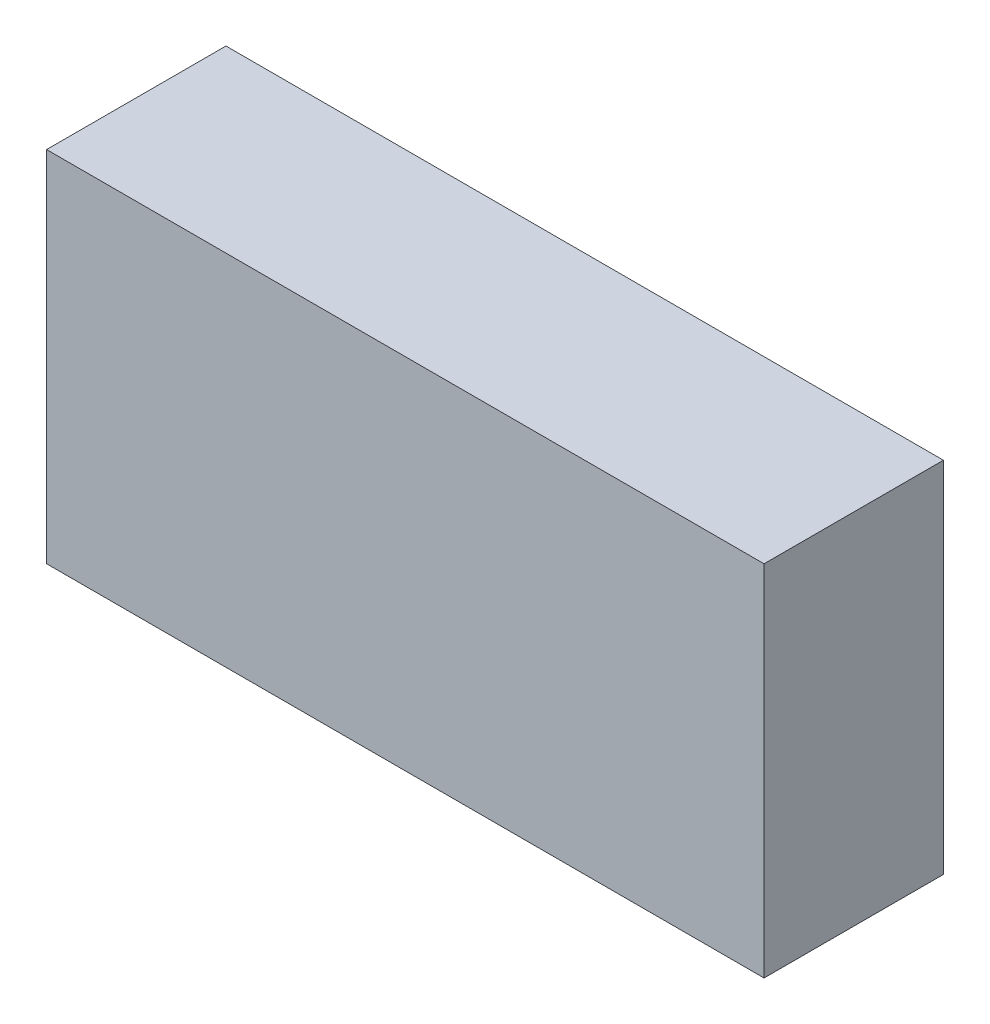
ISO-10303-21;
HEADER;
FILE_DESCRIPTION(('STEP AP214'),'2;1');
FILE_NAME('part.step','',(''),(''),'','','');
FILE_SCHEMA(('AUTOMOTIVE_DESIGN { 1 0 10303 214 1 1 1 1 }'));
ENDSEC;
DATA;
#1=APPLICATION_CONTEXT('core data for automotive mechanical design processes');
#2=APPLICATION_PROTOCOL_DEFINITION('international standard','automotive_design',2000,#1);
#3=PRODUCT_CONTEXT('',#1,'mechanical');
#4=PRODUCT('Part','Part','',(#3));
#5=PRODUCT_RELATED_PRODUCT_CATEGORY('part','',(#4));
#6=PRODUCT_DEFINITION_FORMATION('','',#4);
#7=PRODUCT_DEFINITION_CONTEXT('part definition',#1,'design');
#8=PRODUCT_DEFINITION('design','',#6,#7);
#9=PRODUCT_DEFINITION_SHAPE('','',#8);
#10=(LENGTH_UNIT() NAMED_UNIT(*) SI_UNIT(.MILLI.,.METRE.));
#11=(NAMED_UNIT(*) PLANE_ANGLE_UNIT() SI_UNIT($,.RADIAN.));
#12=(NAMED_UNIT(*) SI_UNIT($,.STERADIAN.) SOLID_ANGLE_UNIT());
#13=UNCERTAINTY_MEASURE_WITH_UNIT(LENGTH_MEASURE(1.E-05),#10,'distance_accuracy_value','');
#14=(GEOMETRIC_REPRESENTATION_CONTEXT(3) GLOBAL_UNCERTAINTY_ASSIGNED_CONTEXT((#13)) GLOBAL_UNIT_ASSIGNED_CONTEXT((#10,
#11,#12)) REPRESENTATION_CONTEXT('',''));
#15=CARTESIAN_POINT('',(0.,0.,0.));
#16=DIRECTION('',(0.,0.,1.));
#17=DIRECTION('',(1.,0.,0.));
#18=AXIS2_PLACEMENT_3D('',#15,#16,#17);
#19=CARTESIAN_POINT('',(0.,0.,-10.));
#20=DIRECTION('',(-1.,0.,0.));
#21=DIRECTION('',(0.,0.,1.));
#22=AXIS2_PLACEMENT_3D('',#19,#20,#21);
#23=PLANE('',#22);
#24=DIRECTION('',(0.,-1.,0.));
#25=VECTOR('',#24,1.);
#26=CARTESIAN_POINT('',(0.,0.,0.));
#27=LINE('',#26,#25);
#28=CARTESIAN_POINT('',(0.,20.,0.));
#29=VERTEX_POINT('',#28);
#30=CARTESIAN_POINT('',(0.,0.,0.));
#31=VERTEX_POINT('',#30);
#32=EDGE_CURVE('E109',#29,#31,#27,.T.);
#33=ORIENTED_EDGE('',*,*,#32,.F.);
#34=DIRECTION('',(0.,0.,1.));
#35=VECTOR('',#34,1.);
#36=CARTESIAN_POINT('',(0.,20.,-10.));
#37=LINE('',#36,#35);
#38=CARTESIAN_POINT('',(0.,20.,-10.));
#39=VERTEX_POINT('',#38);
#40=EDGE_CURVE('E11',#39,#29,#37,.T.);
#41=ORIENTED_EDGE('',*,*,#40,.F.);
#42=DIRECTION('',(0.,-1.,0.));
#43=VECTOR('',#42,1.);
#44=CARTESIAN_POINT('',(0.,0.,-10.));
#45=LINE('',#44,#43);
#46=CARTESIAN_POINT('',(0.,0.,-10.));
#47=VERTEX_POINT('',#46);
#48=EDGE_CURVE('E102',#39,#47,#45,.T.);
#49=ORIENTED_EDGE('',*,*,#48,.T.);
#50=DIRECTION('',(0.,0.,1.));
#51=VECTOR('',#50,1.);
#52=CARTESIAN_POINT('',(0.,0.,-10.));
#53=LINE('',#52,#51);
#54=EDGE_CURVE('E46',#47,#31,#53,.T.);
#55=ORIENTED_EDGE('',*,*,#54,.T.);
#56=EDGE_LOOP('',(#33,#41,#49,#55));
#57=FACE_BOUND('',#56,.T.);
#58=ADVANCED_FACE('F43',(#57),#23,.T.);
#59=CARTESIAN_POINT('',(0.,20.,-10.));
#60=DIRECTION('',(0.,1.,0.));
#61=DIRECTION('',(0.,0.,1.));
#62=AXIS2_PLACEMENT_3D('',#59,#60,#61);
#63=PLANE('',#62);
#64=DIRECTION('',(-1.,0.,0.));
#65=VECTOR('',#64,1.);
#66=CARTESIAN_POINT('',(0.,20.,0.));
#67=LINE('',#66,#65);
#68=CARTESIAN_POINT('',(40.,20.,0.));
#69=VERTEX_POINT('',#68);
#70=EDGE_CURVE('E104',#69,#29,#67,.T.);
#71=ORIENTED_EDGE('',*,*,#70,.F.);
#72=DIRECTION('',(0.,0.,1.));
#73=VECTOR('',#72,1.);
#74=CARTESIAN_POINT('',(40.,20.,-10.));
#75=LINE('',#74,#73);
#76=CARTESIAN_POINT('',(40.,20.,-10.));
#77=VERTEX_POINT('',#76);
#78=EDGE_CURVE('E55',#77,#69,#75,.T.);
#79=ORIENTED_EDGE('',*,*,#78,.F.);
#80=DIRECTION('',(-1.,0.,0.));
#81=VECTOR('',#80,1.);
#82=CARTESIAN_POINT('',(0.,20.,-10.));
#83=LINE('',#82,#81);
#84=EDGE_CURVE('E97',#77,#39,#83,.T.);
#85=ORIENTED_EDGE('',*,*,#84,.T.);
#86=ORIENTED_EDGE('',*,*,#40,.T.);
#87=EDGE_LOOP('',(#71,#79,#85,#86));
#88=FACE_BOUND('',#87,.T.);
#89=ADVANCED_FACE('F119',(#88),#63,.T.);
#90=CARTESIAN_POINT('',(40.,0.,-10.));
#91=DIRECTION('',(1.,0.,0.));
#92=DIRECTION('',(0.,0.,-1.));
#93=AXIS2_PLACEMENT_3D('',#90,#91,#92);
#94=PLANE('',#93);
#95=DIRECTION('',(0.,1.,0.));
#96=VECTOR('',#95,1.);
#97=CARTESIAN_POINT('',(40.,0.,0.));
#98=LINE('',#97,#96);
#99=CARTESIAN_POINT('',(40.,0.,0.));
#100=VERTEX_POINT('',#99);
#101=EDGE_CURVE('E93',#100,#69,#98,.T.);
#102=ORIENTED_EDGE('',*,*,#101,.F.);
#103=DIRECTION('',(0.,0.,1.));
#104=VECTOR('',#103,1.);
#105=CARTESIAN_POINT('',(40.,0.,-10.));
#106=LINE('',#105,#104);
#107=CARTESIAN_POINT('',(40.,0.,-10.));
#108=VERTEX_POINT('',#107);
#109=EDGE_CURVE('E88',#108,#100,#106,.T.);
#110=ORIENTED_EDGE('',*,*,#109,.F.);
#111=DIRECTION('',(0.,1.,0.));
#112=VECTOR('',#111,1.);
#113=CARTESIAN_POINT('',(40.,0.,-10.));
#114=LINE('',#113,#112);
#115=EDGE_CURVE('E91',#108,#77,#114,.T.);
#116=ORIENTED_EDGE('',*,*,#115,.T.);
#117=ORIENTED_EDGE('',*,*,#78,.T.);
#118=EDGE_LOOP('',(#102,#110,#116,#117));
#119=FACE_BOUND('',#118,.T.);
#120=ADVANCED_FACE('F89',(#119),#94,.T.);
#121=CARTESIAN_POINT('',(0.,0.,-10.));
#122=DIRECTION('',(0.,-1.,0.));
#123=DIRECTION('',(0.,0.,-1.));
#124=AXIS2_PLACEMENT_3D('',#121,#122,#123);
#125=PLANE('',#124);
#126=DIRECTION('',(1.,0.,0.));
#127=VECTOR('',#126,1.);
#128=CARTESIAN_POINT('',(0.,0.,0.));
#129=LINE('',#128,#127);
#130=EDGE_CURVE('E108',#31,#100,#129,.T.);
#131=ORIENTED_EDGE('',*,*,#130,.F.);
#132=ORIENTED_EDGE('',*,*,#54,.F.);
#133=DIRECTION('',(1.,0.,0.));
#134=VECTOR('',#133,1.);
#135=CARTESIAN_POINT('',(0.,0.,-10.));
#136=LINE('',#135,#134);
#137=EDGE_CURVE('E100',#47,#108,#136,.T.);
#138=ORIENTED_EDGE('',*,*,#137,.T.);
#139=ORIENTED_EDGE('',*,*,#109,.T.);
#140=EDGE_LOOP('',(#131,#132,#138,#139));
#141=FACE_BOUND('',#140,.T.);
#142=ADVANCED_FACE('F99',(#141),#125,.T.);
#143=CARTESIAN_POINT('',(0.,0.,-10.));
#144=DIRECTION('',(0.,0.,-1.));
#145=DIRECTION('',(-1.,0.,0.));
#146=AXIS2_PLACEMENT_3D('',#143,#144,#145);
#147=PLANE('',#146);
#148=ORIENTED_EDGE('',*,*,#48,.F.);
#149=ORIENTED_EDGE('',*,*,#84,.F.);
#150=ORIENTED_EDGE('',*,*,#115,.F.);
#151=ORIENTED_EDGE('',*,*,#137,.F.);
#152=EDGE_LOOP('',(#148,#149,#150,#151));
#153=FACE_BOUND('',#152,.T.);
#154=ADVANCED_FACE('F96',(#153),#147,.T.);
#155=CARTESIAN_POINT('',(0.,0.,0.));
#156=DIRECTION('',(0.,0.,-1.));
#157=DIRECTION('',(-1.,0.,0.));
#158=AXIS2_PLACEMENT_3D('',#155,#156,#157);
#159=PLANE('',#158);
#160=ORIENTED_EDGE('',*,*,#32,.T.);
#161=ORIENTED_EDGE('',*,*,#130,.T.);
#162=ORIENTED_EDGE('',*,*,#101,.T.);
#163=ORIENTED_EDGE('',*,*,#70,.T.);
#164=EDGE_LOOP('',(#160,#161,#162,#163));
#165=FACE_BOUND('',#164,.T.);
#166=ADVANCED_FACE('F117',(#165),#159,.F.);
#167=CLOSED_SHELL('',(#58,#89,#120,#142,#154,#166));
#168=MANIFOLD_SOLID_BREP('B2',#167);
#169=ADVANCED_BREP_SHAPE_REPRESENTATION('',(#18,#168),#14);
#170=SHAPE_DEFINITION_REPRESENTATION(#9,#169);
ENDSEC;
END-ISO-10303-21;
